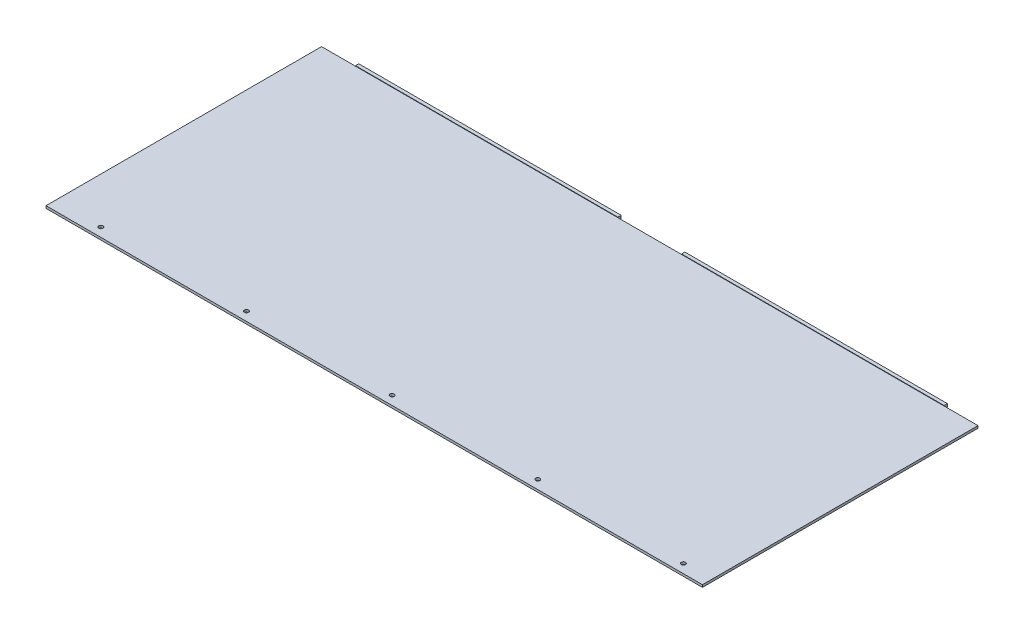
ISO-10303-21;
HEADER;
FILE_DESCRIPTION(('STEP AP214'),'2;1');
FILE_NAME('part.step','',(''),(''),'','','');
FILE_SCHEMA(('AUTOMOTIVE_DESIGN { 1 0 10303 214 1 1 1 1 }'));
ENDSEC;
DATA;
#1=APPLICATION_CONTEXT('core data for automotive mechanical design processes');
#2=APPLICATION_PROTOCOL_DEFINITION('international standard','automotive_design',2000,#1);
#3=PRODUCT_CONTEXT('',#1,'mechanical');
#4=PRODUCT('Part','Part','',(#3));
#5=PRODUCT_RELATED_PRODUCT_CATEGORY('part','',(#4));
#6=PRODUCT_DEFINITION_FORMATION('','',#4);
#7=PRODUCT_DEFINITION_CONTEXT('part definition',#1,'design');
#8=PRODUCT_DEFINITION('design','',#6,#7);
#9=PRODUCT_DEFINITION_SHAPE('','',#8);
#10=(LENGTH_UNIT() NAMED_UNIT(*) SI_UNIT(.MILLI.,.METRE.));
#11=(NAMED_UNIT(*) PLANE_ANGLE_UNIT() SI_UNIT($,.RADIAN.));
#12=(NAMED_UNIT(*) SI_UNIT($,.STERADIAN.) SOLID_ANGLE_UNIT());
#13=UNCERTAINTY_MEASURE_WITH_UNIT(LENGTH_MEASURE(1.E-05),#10,'distance_accuracy_value','');
#14=(GEOMETRIC_REPRESENTATION_CONTEXT(3) GLOBAL_UNCERTAINTY_ASSIGNED_CONTEXT((#13)) GLOBAL_UNIT_ASSIGNED_CONTEXT((#10,
#11,#12)) REPRESENTATION_CONTEXT('',''));
#15=CARTESIAN_POINT('',(0.,0.,0.));
#16=DIRECTION('',(0.,0.,1.));
#17=DIRECTION('',(1.,0.,0.));
#18=AXIS2_PLACEMENT_3D('',#15,#16,#17);
#19=CARTESIAN_POINT('',(290.6522,11.143,124.714));
#20=DIRECTION('',(0.,-1.,0.));
#21=DIRECTION('',(0.,0.,-1.));
#22=AXIS2_PLACEMENT_3D('',#19,#20,#21);
#23=CYLINDRICAL_SURFACE('',#22,2.02500000000001);
#24=CARTESIAN_POINT('',(290.6522,1.143,124.714));
#25=DIRECTION('',(0.,1.,0.));
#26=DIRECTION('',(0.,0.,1.));
#27=AXIS2_PLACEMENT_3D('',#24,#25,#26);
#28=CIRCLE('',#27,2.02500000000001);
#29=CARTESIAN_POINT('',(290.6522,1.143,126.739));
#30=VERTEX_POINT('',#29);
#31=EDGE_CURVE('E44',#30,#30,#28,.F.);
#32=ORIENTED_EDGE('',*,*,#31,.F.);
#33=EDGE_LOOP('',(#32));
#34=FACE_BOUND('',#33,.T.);
#35=CARTESIAN_POINT('',(290.6522,-1.143,124.714));
#36=DIRECTION('',(0.,1.,0.));
#37=DIRECTION('',(0.,0.,1.));
#38=AXIS2_PLACEMENT_3D('',#35,#36,#37);
#39=CIRCLE('',#38,2.02500000000001);
#40=CARTESIAN_POINT('',(290.6522,-1.143,126.739));
#41=VERTEX_POINT('',#40);
#42=EDGE_CURVE('E11',#41,#41,#39,.F.);
#43=ORIENTED_EDGE('',*,*,#42,.T.);
#44=EDGE_LOOP('',(#43));
#45=FACE_BOUND('',#44,.T.);
#46=ADVANCED_FACE('F37',(#34,#45),#23,.F.);
#47=CARTESIAN_POINT('',(149.6822,11.143,124.714));
#48=DIRECTION('',(0.,-1.,0.));
#49=DIRECTION('',(0.,0.,-1.));
#50=AXIS2_PLACEMENT_3D('',#47,#48,#49);
#51=CYLINDRICAL_SURFACE('',#50,2.02500000000001);
#52=CARTESIAN_POINT('',(149.6822,1.143,124.714));
#53=DIRECTION('',(0.,1.,0.));
#54=DIRECTION('',(0.,0.,1.));
#55=AXIS2_PLACEMENT_3D('',#52,#53,#54);
#56=CIRCLE('',#55,2.02500000000001);
#57=CARTESIAN_POINT('',(149.6822,1.143,126.739));
#58=VERTEX_POINT('',#57);
#59=EDGE_CURVE('E247',#58,#58,#56,.F.);
#60=ORIENTED_EDGE('',*,*,#59,.F.);
#61=EDGE_LOOP('',(#60));
#62=FACE_BOUND('',#61,.T.);
#63=CARTESIAN_POINT('',(149.6822,-1.143,124.714));
#64=DIRECTION('',(0.,1.,0.));
#65=DIRECTION('',(0.,0.,1.));
#66=AXIS2_PLACEMENT_3D('',#63,#64,#65);
#67=CIRCLE('',#66,2.02500000000001);
#68=CARTESIAN_POINT('',(149.6822,-1.143,126.739));
#69=VERTEX_POINT('',#68);
#70=EDGE_CURVE('E250',#69,#69,#67,.F.);
#71=ORIENTED_EDGE('',*,*,#70,.T.);
#72=EDGE_LOOP('',(#71));
#73=FACE_BOUND('',#72,.T.);
#74=ADVANCED_FACE('F259',(#62,#73),#51,.F.);
#75=CARTESIAN_POINT('',(8.71219999999995,11.143,124.714));
#76=DIRECTION('',(0.,-1.,0.));
#77=DIRECTION('',(0.,0.,-1.));
#78=AXIS2_PLACEMENT_3D('',#75,#76,#77);
#79=CYLINDRICAL_SURFACE('',#78,2.02500000000001);
#80=CARTESIAN_POINT('',(8.71219999999995,1.143,124.714));
#81=DIRECTION('',(0.,1.,0.));
#82=DIRECTION('',(0.,0.,1.));
#83=AXIS2_PLACEMENT_3D('',#80,#81,#82);
#84=CIRCLE('',#83,2.02500000000001);
#85=CARTESIAN_POINT('',(8.71219999999995,1.143,126.739));
#86=VERTEX_POINT('',#85);
#87=EDGE_CURVE('E241',#86,#86,#84,.F.);
#88=ORIENTED_EDGE('',*,*,#87,.F.);
#89=EDGE_LOOP('',(#88));
#90=FACE_BOUND('',#89,.T.);
#91=CARTESIAN_POINT('',(8.71219999999995,-1.143,124.714));
#92=DIRECTION('',(0.,1.,0.));
#93=DIRECTION('',(0.,0.,1.));
#94=AXIS2_PLACEMENT_3D('',#91,#92,#93);
#95=CIRCLE('',#94,2.02500000000001);
#96=CARTESIAN_POINT('',(8.71219999999995,-1.143,126.739));
#97=VERTEX_POINT('',#96);
#98=EDGE_CURVE('E244',#97,#97,#95,.F.);
#99=ORIENTED_EDGE('',*,*,#98,.T.);
#100=EDGE_LOOP('',(#99));
#101=FACE_BOUND('',#100,.T.);
#102=ADVANCED_FACE('F293',(#90,#101),#79,.F.);
#103=CARTESIAN_POINT('',(-317.6778,1.143,-133.35));
#104=DIRECTION('',(0.,0.,1.));
#105=DIRECTION('',(1.,0.,0.));
#106=AXIS2_PLACEMENT_3D('',#103,#104,#105);
#107=PLANE('',#106);
#108=DIRECTION('',(0.,-1.,0.));
#109=VECTOR('',#108,1.);
#110=CARTESIAN_POINT('',(284.822900000001,-1.143,-133.35));
#111=LINE('',#110,#109);
#112=CARTESIAN_POINT('',(284.822900000002,1.143,-133.35));
#113=VERTEX_POINT('',#112);
#114=CARTESIAN_POINT('',(284.822900000002,-1.143,-133.35));
#115=VERTEX_POINT('',#114);
#116=EDGE_CURVE('E59',#113,#115,#111,.T.);
#117=ORIENTED_EDGE('',*,*,#116,.F.);
#118=DIRECTION('',(-1.,0.,0.));
#119=VECTOR('',#118,1.);
#120=CARTESIAN_POINT('',(-317.6778,1.143,-133.35));
#121=LINE('',#120,#119);
#122=CARTESIAN_POINT('',(317.6778,1.143,-133.35));
#123=VERTEX_POINT('',#122);
#124=EDGE_CURVE('E208',#123,#113,#121,.T.);
#125=ORIENTED_EDGE('',*,*,#124,.F.);
#126=DIRECTION('',(0.,-1.,0.));
#127=VECTOR('',#126,1.);
#128=CARTESIAN_POINT('',(317.6778,1.143,-133.35));
#129=LINE('',#128,#127);
#130=CARTESIAN_POINT('',(317.6778,-1.143,-133.35));
#131=VERTEX_POINT('',#130);
#132=EDGE_CURVE('E233',#123,#131,#129,.T.);
#133=ORIENTED_EDGE('',*,*,#132,.T.);
#134=DIRECTION('',(-1.,0.,0.));
#135=VECTOR('',#134,1.);
#136=CARTESIAN_POINT('',(-317.6778,-1.143,-133.35));
#137=LINE('',#136,#135);
#138=EDGE_CURVE('E219',#131,#115,#137,.T.);
#139=ORIENTED_EDGE('',*,*,#138,.T.);
#140=EDGE_LOOP('',(#117,#125,#133,#139));
#141=FACE_BOUND('',#140,.T.);
#142=ADVANCED_FACE('F289',(#141),#107,.F.);
#143=DIRECTION('',(0.,1.,0.));
#144=VECTOR('',#143,1.);
#145=CARTESIAN_POINT('',(30.8229000000015,1.58749999999994,-133.35));
#146=LINE('',#145,#144);
#147=CARTESIAN_POINT('',(30.8229000000015,-1.143,-133.35));
#148=VERTEX_POINT('',#147);
#149=CARTESIAN_POINT('',(30.8229000000014,1.143,-133.35));
#150=VERTEX_POINT('',#149);
#151=EDGE_CURVE('E484',#148,#150,#146,.T.);
#152=ORIENTED_EDGE('',*,*,#151,.F.);
#153=CARTESIAN_POINT('',(-30.8229000000015,-1.143,-133.35));
#154=VERTEX_POINT('',#153);
#155=EDGE_CURVE('E222',#148,#154,#137,.T.);
#156=ORIENTED_EDGE('',*,*,#155,.T.);
#157=DIRECTION('',(0.,-1.,0.));
#158=VECTOR('',#157,1.);
#159=CARTESIAN_POINT('',(-30.8229000000015,-1.143,-133.35));
#160=LINE('',#159,#158);
#161=CARTESIAN_POINT('',(-30.8229000000015,1.143,-133.35));
#162=VERTEX_POINT('',#161);
#163=EDGE_CURVE('E186',#162,#154,#160,.T.);
#164=ORIENTED_EDGE('',*,*,#163,.F.);
#165=EDGE_CURVE('E51',#150,#162,#121,.T.);
#166=ORIENTED_EDGE('',*,*,#165,.F.);
#167=EDGE_LOOP('',(#152,#156,#164,#166));
#168=FACE_BOUND('',#167,.T.);
#169=ADVANCED_FACE('F292',(#168),#107,.F.);
#170=DIRECTION('',(0.,1.,0.));
#171=VECTOR('',#170,1.);
#172=CARTESIAN_POINT('',(-284.822900000001,1.58749999999994,-133.35));
#173=LINE('',#172,#171);
#174=CARTESIAN_POINT('',(-284.822900000001,-1.143,-133.35));
#175=VERTEX_POINT('',#174);
#176=CARTESIAN_POINT('',(-284.822900000001,1.143,-133.35));
#177=VERTEX_POINT('',#176);
#178=EDGE_CURVE('E187',#175,#177,#173,.T.);
#179=ORIENTED_EDGE('',*,*,#178,.F.);
#180=CARTESIAN_POINT('',(-317.6778,-1.143,-133.35));
#181=VERTEX_POINT('',#180);
#182=EDGE_CURVE('E218',#175,#181,#137,.T.);
#183=ORIENTED_EDGE('',*,*,#182,.T.);
#184=DIRECTION('',(0.,-1.,0.));
#185=VECTOR('',#184,1.);
#186=CARTESIAN_POINT('',(-317.6778,1.143,-133.35));
#187=LINE('',#186,#185);
#188=CARTESIAN_POINT('',(-317.6778,1.143,-133.35));
#189=VERTEX_POINT('',#188);
#190=EDGE_CURVE('E230',#189,#181,#187,.T.);
#191=ORIENTED_EDGE('',*,*,#190,.F.);
#192=EDGE_CURVE('E206',#177,#189,#121,.T.);
#193=ORIENTED_EDGE('',*,*,#192,.F.);
#194=EDGE_LOOP('',(#179,#183,#191,#193));
#195=FACE_BOUND('',#194,.T.);
#196=ADVANCED_FACE('F294',(#195),#107,.F.);
#197=CARTESIAN_POINT('',(317.6778,1.143,-133.35));
#198=DIRECTION('',(-1.,0.,0.));
#199=DIRECTION('',(0.,0.,1.));
#200=AXIS2_PLACEMENT_3D('',#197,#198,#199);
#201=PLANE('',#200);
#202=DIRECTION('',(0.,0.,-1.));
#203=VECTOR('',#202,1.);
#204=CARTESIAN_POINT('',(317.6778,-1.143,-133.35));
#205=LINE('',#204,#203);
#206=CARTESIAN_POINT('',(317.6778,-1.143,133.35));
#207=VERTEX_POINT('',#206);
#208=EDGE_CURVE('E202',#207,#131,#205,.T.);
#209=ORIENTED_EDGE('',*,*,#208,.T.);
#210=ORIENTED_EDGE('',*,*,#132,.F.);
#211=DIRECTION('',(0.,0.,-1.));
#212=VECTOR('',#211,1.);
#213=CARTESIAN_POINT('',(317.6778,1.143,-133.35));
#214=LINE('',#213,#212);
#215=CARTESIAN_POINT('',(317.6778,1.143,133.35));
#216=VERTEX_POINT('',#215);
#217=EDGE_CURVE('E203',#216,#123,#214,.T.);
#218=ORIENTED_EDGE('',*,*,#217,.F.);
#219=DIRECTION('',(0.,-1.,0.));
#220=VECTOR('',#219,1.);
#221=CARTESIAN_POINT('',(317.6778,1.143,133.35));
#222=LINE('',#221,#220);
#223=EDGE_CURVE('E215',#216,#207,#222,.T.);
#224=ORIENTED_EDGE('',*,*,#223,.T.);
#225=EDGE_LOOP('',(#209,#210,#218,#224));
#226=FACE_BOUND('',#225,.T.);
#227=ADVANCED_FACE('F287',(#226),#201,.F.);
#228=CARTESIAN_POINT('',(-317.6778,1.143,-133.35));
#229=DIRECTION('',(1.,0.,0.));
#230=DIRECTION('',(0.,0.,-1.));
#231=AXIS2_PLACEMENT_3D('',#228,#229,#230);
#232=PLANE('',#231);
#233=DIRECTION('',(0.,0.,1.));
#234=VECTOR('',#233,1.);
#235=CARTESIAN_POINT('',(-317.6778,-1.143,-133.35));
#236=LINE('',#235,#234);
#237=CARTESIAN_POINT('',(-317.6778,-1.143,133.35));
#238=VERTEX_POINT('',#237);
#239=EDGE_CURVE('E221',#181,#238,#236,.T.);
#240=ORIENTED_EDGE('',*,*,#239,.T.);
#241=DIRECTION('',(0.,-1.,0.));
#242=VECTOR('',#241,1.);
#243=CARTESIAN_POINT('',(-317.6778,1.143,133.35));
#244=LINE('',#243,#242);
#245=CARTESIAN_POINT('',(-317.6778,1.143,133.35));
#246=VERTEX_POINT('',#245);
#247=EDGE_CURVE('E227',#246,#238,#244,.T.);
#248=ORIENTED_EDGE('',*,*,#247,.F.);
#249=DIRECTION('',(0.,0.,1.));
#250=VECTOR('',#249,1.);
#251=CARTESIAN_POINT('',(-317.6778,1.143,-133.35));
#252=LINE('',#251,#250);
#253=EDGE_CURVE('E210',#189,#246,#252,.T.);
#254=ORIENTED_EDGE('',*,*,#253,.F.);
#255=ORIENTED_EDGE('',*,*,#190,.T.);
#256=EDGE_LOOP('',(#240,#248,#254,#255));
#257=FACE_BOUND('',#256,.T.);
#258=ADVANCED_FACE('F283',(#257),#232,.F.);
#259=CARTESIAN_POINT('',(-317.6778,1.143,133.35));
#260=DIRECTION('',(0.,0.,-1.));
#261=DIRECTION('',(-1.,0.,0.));
#262=AXIS2_PLACEMENT_3D('',#259,#260,#261);
#263=PLANE('',#262);
#264=DIRECTION('',(1.,0.,0.));
#265=VECTOR('',#264,1.);
#266=CARTESIAN_POINT('',(-317.6778,-1.143,133.35));
#267=LINE('',#266,#265);
#268=EDGE_CURVE('E207',#238,#207,#267,.T.);
#269=ORIENTED_EDGE('',*,*,#268,.T.);
#270=ORIENTED_EDGE('',*,*,#223,.F.);
#271=DIRECTION('',(1.,0.,0.));
#272=VECTOR('',#271,1.);
#273=CARTESIAN_POINT('',(-317.6778,1.143,133.35));
#274=LINE('',#273,#272);
#275=EDGE_CURVE('E213',#246,#216,#274,.T.);
#276=ORIENTED_EDGE('',*,*,#275,.F.);
#277=ORIENTED_EDGE('',*,*,#247,.T.);
#278=EDGE_LOOP('',(#269,#270,#276,#277));
#279=FACE_BOUND('',#278,.T.);
#280=ADVANCED_FACE('F274',(#279),#263,.F.);
#281=CARTESIAN_POINT('',(0.,1.143,0.));
#282=DIRECTION('',(0.,1.,0.));
#283=DIRECTION('',(0.,0.,1.));
#284=AXIS2_PLACEMENT_3D('',#281,#282,#283);
#285=PLANE('',#284);
#286=CARTESIAN_POINT('',(-132.2578,1.143,124.714));
#287=DIRECTION('',(0.,1.,0.));
#288=DIRECTION('',(0.,0.,1.));
#289=AXIS2_PLACEMENT_3D('',#286,#287,#288);
#290=CIRCLE('',#289,2.02500000000001);
#291=CARTESIAN_POINT('',(-132.2578,1.143,126.739));
#292=VERTEX_POINT('',#291);
#293=EDGE_CURVE('E534',#292,#292,#290,.F.);
#294=ORIENTED_EDGE('',*,*,#293,.T.);
#295=EDGE_LOOP('',(#294));
#296=FACE_BOUND('',#295,.T.);
#297=CARTESIAN_POINT('',(-273.2278,1.143,124.714));
#298=DIRECTION('',(0.,1.,0.));
#299=DIRECTION('',(0.,0.,1.));
#300=AXIS2_PLACEMENT_3D('',#297,#298,#299);
#301=CIRCLE('',#300,2.02500000000001);
#302=CARTESIAN_POINT('',(-273.2278,1.143,126.739));
#303=VERTEX_POINT('',#302);
#304=EDGE_CURVE('E239',#303,#303,#301,.F.);
#305=ORIENTED_EDGE('',*,*,#304,.T.);
#306=EDGE_LOOP('',(#305));
#307=FACE_BOUND('',#306,.T.);
#308=ORIENTED_EDGE('',*,*,#217,.T.);
#309=ORIENTED_EDGE('',*,*,#124,.T.);
#310=DIRECTION('',(1.,0.,0.));
#311=VECTOR('',#310,1.);
#312=CARTESIAN_POINT('',(0.,1.143,-133.35));
#313=LINE('',#312,#311);
#314=EDGE_CURVE('E163',#150,#113,#313,.T.);
#315=ORIENTED_EDGE('',*,*,#314,.F.);
#316=ORIENTED_EDGE('',*,*,#165,.T.);
#317=EDGE_CURVE('E211',#162,#177,#121,.T.);
#318=ORIENTED_EDGE('',*,*,#317,.T.);
#319=ORIENTED_EDGE('',*,*,#192,.T.);
#320=ORIENTED_EDGE('',*,*,#253,.T.);
#321=ORIENTED_EDGE('',*,*,#275,.T.);
#322=EDGE_LOOP('',(#308,#309,#315,#316,#318,#319,#320,#321));
#323=FACE_BOUND('',#322,.T.);
#324=ORIENTED_EDGE('',*,*,#87,.T.);
#325=EDGE_LOOP('',(#324));
#326=FACE_BOUND('',#325,.T.);
#327=ORIENTED_EDGE('',*,*,#59,.T.);
#328=EDGE_LOOP('',(#327));
#329=FACE_BOUND('',#328,.T.);
#330=ORIENTED_EDGE('',*,*,#31,.T.);
#331=EDGE_LOOP('',(#330));
#332=FACE_BOUND('',#331,.T.);
#333=ADVANCED_FACE('F255',(#296,#307,#323,#326,#329,#332),#285,.T.);
#334=CARTESIAN_POINT('',(0.,-1.143,0.));
#335=DIRECTION('',(0.,1.,0.));
#336=DIRECTION('',(0.,0.,1.));
#337=AXIS2_PLACEMENT_3D('',#334,#335,#336);
#338=PLANE('',#337);
#339=CARTESIAN_POINT('',(-132.2578,-1.143,124.714));
#340=DIRECTION('',(0.,1.,0.));
#341=DIRECTION('',(0.,0.,1.));
#342=AXIS2_PLACEMENT_3D('',#339,#340,#341);
#343=CIRCLE('',#342,2.02500000000001);
#344=CARTESIAN_POINT('',(-132.2578,-1.143,126.739));
#345=VERTEX_POINT('',#344);
#346=EDGE_CURVE('E240',#345,#345,#343,.F.);
#347=ORIENTED_EDGE('',*,*,#346,.F.);
#348=EDGE_LOOP('',(#347));
#349=FACE_BOUND('',#348,.T.);
#350=CARTESIAN_POINT('',(-273.2278,-1.143,124.714));
#351=DIRECTION('',(0.,1.,0.));
#352=DIRECTION('',(0.,0.,1.));
#353=AXIS2_PLACEMENT_3D('',#350,#351,#352);
#354=CIRCLE('',#353,2.02500000000001);
#355=CARTESIAN_POINT('',(-273.2278,-1.143,126.739));
#356=VERTEX_POINT('',#355);
#357=EDGE_CURVE('E236',#356,#356,#354,.F.);
#358=ORIENTED_EDGE('',*,*,#357,.F.);
#359=EDGE_LOOP('',(#358));
#360=FACE_BOUND('',#359,.T.);
#361=ORIENTED_EDGE('',*,*,#208,.F.);
#362=ORIENTED_EDGE('',*,*,#268,.F.);
#363=ORIENTED_EDGE('',*,*,#239,.F.);
#364=ORIENTED_EDGE('',*,*,#182,.F.);
#365=DIRECTION('',(0.,0.,1.));
#366=VECTOR('',#365,1.);
#367=CARTESIAN_POINT('',(-284.822900000001,-1.143,-136.525));
#368=LINE('',#367,#366);
#369=CARTESIAN_POINT('',(-284.822900000001,-1.143,-136.525));
#370=VERTEX_POINT('',#369);
#371=EDGE_CURVE('E196',#370,#175,#368,.T.);
#372=ORIENTED_EDGE('',*,*,#371,.F.);
#373=DIRECTION('',(-1.,0.,0.));
#374=VECTOR('',#373,1.);
#375=CARTESIAN_POINT('',(-30.8229000000015,-1.143,-136.525));
#376=LINE('',#375,#374);
#377=CARTESIAN_POINT('',(-30.8229000000015,-1.143,-136.525));
#378=VERTEX_POINT('',#377);
#379=EDGE_CURVE('E175',#378,#370,#376,.T.);
#380=ORIENTED_EDGE('',*,*,#379,.F.);
#381=DIRECTION('',(0.,0.,1.));
#382=VECTOR('',#381,1.);
#383=CARTESIAN_POINT('',(-30.8229000000015,-1.143,-136.525));
#384=LINE('',#383,#382);
#385=EDGE_CURVE('E199',#378,#154,#384,.T.);
#386=ORIENTED_EDGE('',*,*,#385,.T.);
#387=ORIENTED_EDGE('',*,*,#155,.F.);
#388=DIRECTION('',(0.,0.,1.));
#389=VECTOR('',#388,1.);
#390=CARTESIAN_POINT('',(30.8229000000015,-1.143,-136.525));
#391=LINE('',#390,#389);
#392=CARTESIAN_POINT('',(30.8229000000015,-1.143,-136.525));
#393=VERTEX_POINT('',#392);
#394=EDGE_CURVE('E146',#393,#148,#391,.T.);
#395=ORIENTED_EDGE('',*,*,#394,.F.);
#396=DIRECTION('',(-1.,0.,0.));
#397=VECTOR('',#396,1.);
#398=CARTESIAN_POINT('',(284.822900000001,-1.143,-136.525));
#399=LINE('',#398,#397);
#400=CARTESIAN_POINT('',(284.822900000001,-1.143,-136.525));
#401=VERTEX_POINT('',#400);
#402=EDGE_CURVE('E138',#401,#393,#399,.T.);
#403=ORIENTED_EDGE('',*,*,#402,.F.);
#404=DIRECTION('',(0.,0.,1.));
#405=VECTOR('',#404,1.);
#406=CARTESIAN_POINT('',(284.822900000001,-1.143,-136.525));
#407=LINE('',#406,#405);
#408=EDGE_CURVE('E144',#401,#115,#407,.T.);
#409=ORIENTED_EDGE('',*,*,#408,.T.);
#410=ORIENTED_EDGE('',*,*,#138,.F.);
#411=EDGE_LOOP('',(#361,#362,#363,#364,#372,#380,#386,#387,#395,#403,#409,#410));
#412=FACE_BOUND('',#411,.T.);
#413=ORIENTED_EDGE('',*,*,#98,.F.);
#414=EDGE_LOOP('',(#413));
#415=FACE_BOUND('',#414,.T.);
#416=ORIENTED_EDGE('',*,*,#70,.F.);
#417=EDGE_LOOP('',(#416));
#418=FACE_BOUND('',#417,.T.);
#419=ORIENTED_EDGE('',*,*,#42,.F.);
#420=EDGE_LOOP('',(#419));
#421=FACE_BOUND('',#420,.T.);
#422=ADVANCED_FACE('F141',(#349,#360,#412,#415,#418,#421),#338,.F.);
#423=CARTESIAN_POINT('',(0.,0.,-133.35));
#424=DIRECTION('',(0.,0.,1.));
#425=DIRECTION('',(1.,0.,0.));
#426=AXIS2_PLACEMENT_3D('',#423,#424,#425);
#427=PLANE('',#426);
#428=ORIENTED_EDGE('',*,*,#317,.F.);
#429=CARTESIAN_POINT('',(-30.8229000000015,1.58749999999994,-133.35));
#430=VERTEX_POINT('',#429);
#431=EDGE_CURVE('E166',#430,#162,#160,.T.);
#432=ORIENTED_EDGE('',*,*,#431,.F.);
#433=DIRECTION('',(1.,0.,0.));
#434=VECTOR('',#433,1.);
#435=CARTESIAN_POINT('',(-30.8229000000015,1.58749999999994,-133.35));
#436=LINE('',#435,#434);
#437=CARTESIAN_POINT('',(-284.822900000001,1.58749999999994,-133.35));
#438=VERTEX_POINT('',#437);
#439=EDGE_CURVE('E176',#438,#430,#436,.T.);
#440=ORIENTED_EDGE('',*,*,#439,.F.);
#441=EDGE_CURVE('E185',#177,#438,#173,.T.);
#442=ORIENTED_EDGE('',*,*,#441,.F.);
#443=EDGE_LOOP('',(#428,#432,#440,#442));
#444=FACE_BOUND('',#443,.T.);
#445=ADVANCED_FACE('F263',(#444),#427,.T.);
#446=CARTESIAN_POINT('',(-30.8229000000015,-1.143,-136.525));
#447=DIRECTION('',(-1.,0.,0.));
#448=DIRECTION('',(0.,0.,1.));
#449=AXIS2_PLACEMENT_3D('',#446,#447,#448);
#450=PLANE('',#449);
#451=ORIENTED_EDGE('',*,*,#431,.T.);
#452=ORIENTED_EDGE('',*,*,#163,.T.);
#453=ORIENTED_EDGE('',*,*,#385,.F.);
#454=DIRECTION('',(0.,-1.,0.));
#455=VECTOR('',#454,1.);
#456=CARTESIAN_POINT('',(-30.8229000000015,-1.143,-136.525));
#457=LINE('',#456,#455);
#458=CARTESIAN_POINT('',(-30.8229000000015,1.58749999999994,-136.525));
#459=VERTEX_POINT('',#458);
#460=EDGE_CURVE('E172',#459,#378,#457,.T.);
#461=ORIENTED_EDGE('',*,*,#460,.F.);
#462=DIRECTION('',(0.,0.,1.));
#463=VECTOR('',#462,1.);
#464=CARTESIAN_POINT('',(-30.8229000000015,1.58749999999994,-136.525));
#465=LINE('',#464,#463);
#466=EDGE_CURVE('E182',#459,#430,#465,.T.);
#467=ORIENTED_EDGE('',*,*,#466,.T.);
#468=EDGE_LOOP('',(#451,#452,#453,#461,#467));
#469=FACE_BOUND('',#468,.T.);
#470=ADVANCED_FACE('F271',(#469),#450,.F.);
#471=CARTESIAN_POINT('',(-284.822900000001,1.58749999999994,-136.525));
#472=DIRECTION('',(1.,0.,0.));
#473=DIRECTION('',(0.,1.,0.));
#474=AXIS2_PLACEMENT_3D('',#471,#472,#473);
#475=PLANE('',#474);
#476=ORIENTED_EDGE('',*,*,#178,.T.);
#477=ORIENTED_EDGE('',*,*,#441,.T.);
#478=DIRECTION('',(0.,0.,1.));
#479=VECTOR('',#478,1.);
#480=CARTESIAN_POINT('',(-284.822900000001,1.58749999999994,-136.525));
#481=LINE('',#480,#479);
#482=CARTESIAN_POINT('',(-284.822900000001,1.58749999999994,-136.525));
#483=VERTEX_POINT('',#482);
#484=EDGE_CURVE('E193',#483,#438,#481,.T.);
#485=ORIENTED_EDGE('',*,*,#484,.F.);
#486=DIRECTION('',(0.,1.,0.));
#487=VECTOR('',#486,1.);
#488=CARTESIAN_POINT('',(-284.822900000001,1.58749999999994,-136.525));
#489=LINE('',#488,#487);
#490=EDGE_CURVE('E178',#370,#483,#489,.T.);
#491=ORIENTED_EDGE('',*,*,#490,.F.);
#492=ORIENTED_EDGE('',*,*,#371,.T.);
#493=EDGE_LOOP('',(#476,#477,#485,#491,#492));
#494=FACE_BOUND('',#493,.T.);
#495=ADVANCED_FACE('F401',(#494),#475,.F.);
#496=CARTESIAN_POINT('',(-30.8229000000015,1.58749999999994,-136.525));
#497=DIRECTION('',(0.,-1.,0.));
#498=DIRECTION('',(0.,0.,-1.));
#499=AXIS2_PLACEMENT_3D('',#496,#497,#498);
#500=PLANE('',#499);
#501=ORIENTED_EDGE('',*,*,#439,.T.);
#502=ORIENTED_EDGE('',*,*,#466,.F.);
#503=DIRECTION('',(1.,0.,0.));
#504=VECTOR('',#503,1.);
#505=CARTESIAN_POINT('',(-30.8229000000015,1.58749999999994,-136.525));
#506=LINE('',#505,#504);
#507=EDGE_CURVE('E180',#483,#459,#506,.T.);
#508=ORIENTED_EDGE('',*,*,#507,.F.);
#509=ORIENTED_EDGE('',*,*,#484,.T.);
#510=EDGE_LOOP('',(#501,#502,#508,#509));
#511=FACE_BOUND('',#510,.T.);
#512=ADVANCED_FACE('F392',(#511),#500,.F.);
#513=CARTESIAN_POINT('',(0.,0.,-136.525));
#514=DIRECTION('',(0.,0.,1.));
#515=DIRECTION('',(1.,0.,0.));
#516=AXIS2_PLACEMENT_3D('',#513,#514,#515);
#517=PLANE('',#516);
#518=ORIENTED_EDGE('',*,*,#460,.T.);
#519=ORIENTED_EDGE('',*,*,#379,.T.);
#520=ORIENTED_EDGE('',*,*,#490,.T.);
#521=ORIENTED_EDGE('',*,*,#507,.T.);
#522=EDGE_LOOP('',(#518,#519,#520,#521));
#523=FACE_BOUND('',#522,.T.);
#524=ADVANCED_FACE('F384',(#523),#517,.F.);
#525=CARTESIAN_POINT('',(284.822900000001,-1.143,-136.525));
#526=DIRECTION('',(-1.,0.,0.));
#527=DIRECTION('',(0.,-1.,0.));
#528=AXIS2_PLACEMENT_3D('',#525,#526,#527);
#529=PLANE('',#528);
#530=CARTESIAN_POINT('',(284.822900000001,1.58749999999994,-133.35));
#531=VERTEX_POINT('',#530);
#532=EDGE_CURVE('E494',#531,#113,#111,.T.);
#533=ORIENTED_EDGE('',*,*,#532,.T.);
#534=ORIENTED_EDGE('',*,*,#116,.T.);
#535=ORIENTED_EDGE('',*,*,#408,.F.);
#536=DIRECTION('',(0.,-1.,0.));
#537=VECTOR('',#536,1.);
#538=CARTESIAN_POINT('',(284.822900000001,-1.143,-136.525));
#539=LINE('',#538,#537);
#540=CARTESIAN_POINT('',(284.822900000001,1.58749999999994,-136.525));
#541=VERTEX_POINT('',#540);
#542=EDGE_CURVE('E150',#541,#401,#539,.T.);
#543=ORIENTED_EDGE('',*,*,#542,.F.);
#544=DIRECTION('',(0.,0.,1.));
#545=VECTOR('',#544,1.);
#546=CARTESIAN_POINT('',(284.822900000001,1.58749999999994,-136.525));
#547=LINE('',#546,#545);
#548=EDGE_CURVE('E491',#541,#531,#547,.T.);
#549=ORIENTED_EDGE('',*,*,#548,.T.);
#550=EDGE_LOOP('',(#533,#534,#535,#543,#549));
#551=FACE_BOUND('',#550,.T.);
#552=ADVANCED_FACE('F162',(#551),#529,.F.);
#553=CARTESIAN_POINT('',(30.8229000000015,1.58749999999994,-136.525));
#554=DIRECTION('',(1.,0.,0.));
#555=DIRECTION('',(0.,0.,-1.));
#556=AXIS2_PLACEMENT_3D('',#553,#554,#555);
#557=PLANE('',#556);
#558=ORIENTED_EDGE('',*,*,#151,.T.);
#559=CARTESIAN_POINT('',(30.8229000000015,1.58749999999994,-133.35));
#560=VERTEX_POINT('',#559);
#561=EDGE_CURVE('E486',#150,#560,#146,.T.);
#562=ORIENTED_EDGE('',*,*,#561,.T.);
#563=DIRECTION('',(0.,0.,1.));
#564=VECTOR('',#563,1.);
#565=CARTESIAN_POINT('',(30.8229000000015,1.58749999999994,-136.525));
#566=LINE('',#565,#564);
#567=CARTESIAN_POINT('',(30.8229000000015,1.58749999999994,-136.525));
#568=VERTEX_POINT('',#567);
#569=EDGE_CURVE('E168',#568,#560,#566,.T.);
#570=ORIENTED_EDGE('',*,*,#569,.F.);
#571=DIRECTION('',(0.,1.,0.));
#572=VECTOR('',#571,1.);
#573=CARTESIAN_POINT('',(30.8229000000015,1.58749999999994,-136.525));
#574=LINE('',#573,#572);
#575=EDGE_CURVE('E149',#393,#568,#574,.T.);
#576=ORIENTED_EDGE('',*,*,#575,.F.);
#577=ORIENTED_EDGE('',*,*,#394,.T.);
#578=EDGE_LOOP('',(#558,#562,#570,#576,#577));
#579=FACE_BOUND('',#578,.T.);
#580=ADVANCED_FACE('F367',(#579),#557,.F.);
#581=CARTESIAN_POINT('',(284.822900000001,1.58749999999994,-136.525));
#582=DIRECTION('',(0.,-1.,0.));
#583=DIRECTION('',(0.,0.,-1.));
#584=AXIS2_PLACEMENT_3D('',#581,#582,#583);
#585=PLANE('',#584);
#586=DIRECTION('',(1.,0.,0.));
#587=VECTOR('',#586,1.);
#588=CARTESIAN_POINT('',(284.822900000001,1.58749999999994,-133.35));
#589=LINE('',#588,#587);
#590=EDGE_CURVE('E159',#560,#531,#589,.T.);
#591=ORIENTED_EDGE('',*,*,#590,.T.);
#592=ORIENTED_EDGE('',*,*,#548,.F.);
#593=DIRECTION('',(1.,0.,0.));
#594=VECTOR('',#593,1.);
#595=CARTESIAN_POINT('',(284.822900000001,1.58749999999994,-136.525));
#596=LINE('',#595,#594);
#597=EDGE_CURVE('E155',#568,#541,#596,.T.);
#598=ORIENTED_EDGE('',*,*,#597,.F.);
#599=ORIENTED_EDGE('',*,*,#569,.T.);
#600=EDGE_LOOP('',(#591,#592,#598,#599));
#601=FACE_BOUND('',#600,.T.);
#602=ADVANCED_FACE('F359',(#601),#585,.F.);
#603=CARTESIAN_POINT('',(0.,0.,-136.525));
#604=DIRECTION('',(0.,0.,1.));
#605=DIRECTION('',(1.,0.,0.));
#606=AXIS2_PLACEMENT_3D('',#603,#604,#605);
#607=PLANE('',#606);
#608=ORIENTED_EDGE('',*,*,#542,.T.);
#609=ORIENTED_EDGE('',*,*,#402,.T.);
#610=ORIENTED_EDGE('',*,*,#575,.T.);
#611=ORIENTED_EDGE('',*,*,#597,.T.);
#612=EDGE_LOOP('',(#608,#609,#610,#611));
#613=FACE_BOUND('',#612,.T.);
#614=ADVANCED_FACE('F153',(#613),#607,.F.);
#615=CARTESIAN_POINT('',(0.,0.,-133.35));
#616=DIRECTION('',(0.,0.,1.));
#617=DIRECTION('',(1.,0.,0.));
#618=AXIS2_PLACEMENT_3D('',#615,#616,#617);
#619=PLANE('',#618);
#620=ORIENTED_EDGE('',*,*,#561,.F.);
#621=ORIENTED_EDGE('',*,*,#314,.T.);
#622=ORIENTED_EDGE('',*,*,#532,.F.);
#623=ORIENTED_EDGE('',*,*,#590,.F.);
#624=EDGE_LOOP('',(#620,#621,#622,#623));
#625=FACE_BOUND('',#624,.T.);
#626=ADVANCED_FACE('F324',(#625),#619,.T.);
#627=CARTESIAN_POINT('',(-273.2278,11.143,124.714));
#628=DIRECTION('',(0.,-1.,0.));
#629=DIRECTION('',(0.,0.,-1.));
#630=AXIS2_PLACEMENT_3D('',#627,#628,#629);
#631=CYLINDRICAL_SURFACE('',#630,2.02500000000001);
#632=ORIENTED_EDGE('',*,*,#304,.F.);
#633=EDGE_LOOP('',(#632));
#634=FACE_BOUND('',#633,.T.);
#635=ORIENTED_EDGE('',*,*,#357,.T.);
#636=EDGE_LOOP('',(#635));
#637=FACE_BOUND('',#636,.T.);
#638=ADVANCED_FACE('F319',(#634,#637),#631,.F.);
#639=CARTESIAN_POINT('',(-132.2578,11.143,124.714));
#640=DIRECTION('',(0.,-1.,0.));
#641=DIRECTION('',(0.,0.,-1.));
#642=AXIS2_PLACEMENT_3D('',#639,#640,#641);
#643=CYLINDRICAL_SURFACE('',#642,2.02500000000001);
#644=ORIENTED_EDGE('',*,*,#293,.F.);
#645=EDGE_LOOP('',(#644));
#646=FACE_BOUND('',#645,.T.);
#647=ORIENTED_EDGE('',*,*,#346,.T.);
#648=EDGE_LOOP('',(#647));
#649=FACE_BOUND('',#648,.T.);
#650=ADVANCED_FACE('F323',(#646,#649),#643,.F.);
#651=CLOSED_SHELL('',(#46,#74,#102,#142,#169,#196,#227,#258,#280,#333,#422,#445,#470,#495,#512,
#524,#552,#580,#602,#614,#626,#638,#650));
#652=MANIFOLD_SOLID_BREP('B2',#651);
#653=ADVANCED_BREP_SHAPE_REPRESENTATION('',(#18,#652),#14);
#654=SHAPE_DEFINITION_REPRESENTATION(#9,#653);
ENDSEC;
END-ISO-10303-21;
